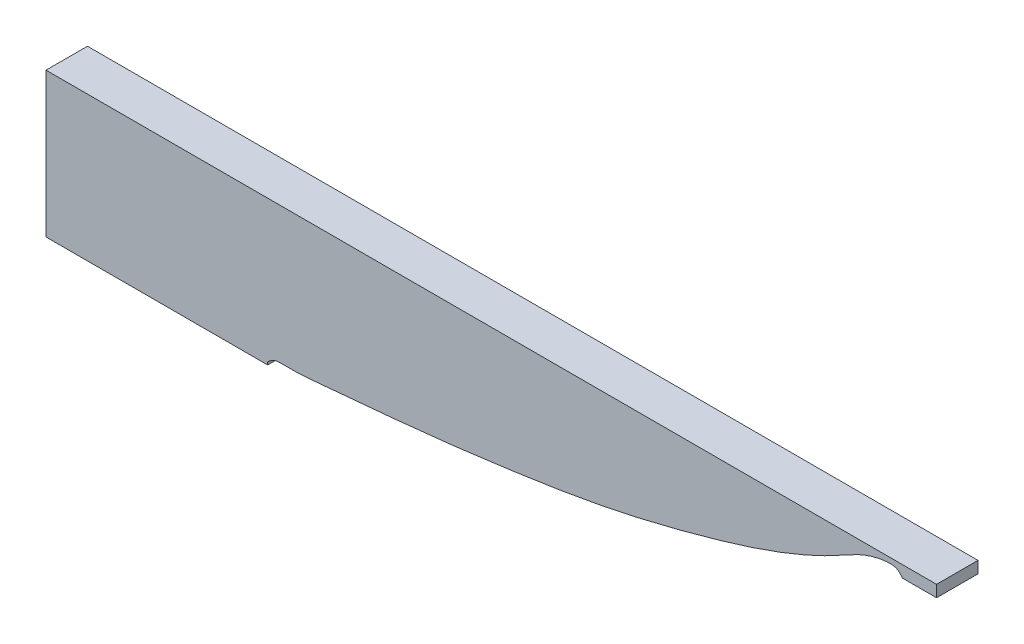
ISO-10303-21;
HEADER;
FILE_DESCRIPTION(('STEP AP214'),'2;1');
FILE_NAME('part.step','',(''),(''),'','','');
FILE_SCHEMA(('AUTOMOTIVE_DESIGN { 1 0 10303 214 1 1 1 1 }'));
ENDSEC;
DATA;
#1=APPLICATION_CONTEXT('core data for automotive mechanical design processes');
#2=APPLICATION_PROTOCOL_DEFINITION('international standard','automotive_design',2000,#1);
#3=PRODUCT_CONTEXT('',#1,'mechanical');
#4=PRODUCT('Part','Part','',(#3));
#5=PRODUCT_RELATED_PRODUCT_CATEGORY('part','',(#4));
#6=PRODUCT_DEFINITION_FORMATION('','',#4);
#7=PRODUCT_DEFINITION_CONTEXT('part definition',#1,'design');
#8=PRODUCT_DEFINITION('design','',#6,#7);
#9=PRODUCT_DEFINITION_SHAPE('','',#8);
#10=(LENGTH_UNIT() NAMED_UNIT(*) SI_UNIT(.MILLI.,.METRE.));
#11=(NAMED_UNIT(*) PLANE_ANGLE_UNIT() SI_UNIT($,.RADIAN.));
#12=(NAMED_UNIT(*) SI_UNIT($,.STERADIAN.) SOLID_ANGLE_UNIT());
#13=UNCERTAINTY_MEASURE_WITH_UNIT(LENGTH_MEASURE(1.E-05),#10,'distance_accuracy_value','');
#14=(GEOMETRIC_REPRESENTATION_CONTEXT(3) GLOBAL_UNCERTAINTY_ASSIGNED_CONTEXT((#13)) GLOBAL_UNIT_ASSIGNED_CONTEXT((#10,
#11,#12)) REPRESENTATION_CONTEXT('',''));
#15=CARTESIAN_POINT('',(0.,0.,0.));
#16=DIRECTION('',(0.,0.,1.));
#17=DIRECTION('',(1.,0.,0.));
#18=AXIS2_PLACEMENT_3D('',#15,#16,#17);
#19=CARTESIAN_POINT('',(76.554074471243,2.25600000000005,372.));
#20=DIRECTION('',(-1.,0.,0.));
#21=DIRECTION('',(0.,0.,1.));
#22=AXIS2_PLACEMENT_3D('',#19,#20,#21);
#23=PLANE('',#22);
#24=DIRECTION('',(0.,1.,0.));
#25=VECTOR('',#24,1.);
#26=CARTESIAN_POINT('',(76.554074471243,2.25600000000005,364.));
#27=LINE('',#26,#25);
#28=CARTESIAN_POINT('',(76.554074471243,0.,364.));
#29=VERTEX_POINT('',#28);
#30=CARTESIAN_POINT('',(76.554074471243,2.25600000000005,364.));
#31=VERTEX_POINT('',#30);
#32=EDGE_CURVE('E151',#29,#31,#27,.T.);
#33=ORIENTED_EDGE('',*,*,#32,.T.);
#34=DIRECTION('',(0.,0.,-1.));
#35=VECTOR('',#34,1.);
#36=CARTESIAN_POINT('',(76.554074471243,2.25600000000005,372.));
#37=LINE('',#36,#35);
#38=CARTESIAN_POINT('',(76.554074471243,2.25600000000005,372.));
#39=VERTEX_POINT('',#38);
#40=EDGE_CURVE('E11',#39,#31,#37,.T.);
#41=ORIENTED_EDGE('',*,*,#40,.F.);
#42=DIRECTION('',(0.,1.,0.));
#43=VECTOR('',#42,1.);
#44=CARTESIAN_POINT('',(76.554074471243,2.25600000000005,372.));
#45=LINE('',#44,#43);
#46=CARTESIAN_POINT('',(76.554074471243,0.,372.));
#47=VERTEX_POINT('',#46);
#48=EDGE_CURVE('E205',#47,#39,#45,.T.);
#49=ORIENTED_EDGE('',*,*,#48,.F.);
#50=DIRECTION('',(0.,0.,-1.));
#51=VECTOR('',#50,1.);
#52=CARTESIAN_POINT('',(76.554074471243,0.,372.));
#53=LINE('',#52,#51);
#54=EDGE_CURVE('E160',#47,#29,#53,.T.);
#55=ORIENTED_EDGE('',*,*,#54,.T.);
#56=EDGE_LOOP('',(#33,#41,#49,#55));
#57=FACE_BOUND('',#56,.T.);
#58=ADVANCED_FACE('F30',(#57),#23,.F.);
#59=CARTESIAN_POINT('',(76.554074471243,2.25600000000005,372.));
#60=DIRECTION('',(0.,-1.,0.));
#61=DIRECTION('',(1.,0.,0.));
#62=AXIS2_PLACEMENT_3D('',#59,#60,#61);
#63=PLANE('',#62);
#64=DIRECTION('',(-1.,0.,0.));
#65=VECTOR('',#64,1.);
#66=CARTESIAN_POINT('',(76.554074471243,2.25600000000005,364.));
#67=LINE('',#66,#65);
#68=CARTESIAN_POINT('',(-95.2696988658699,2.25600000000002,364.));
#69=VERTEX_POINT('',#68);
#70=EDGE_CURVE('E157',#31,#69,#67,.T.);
#71=ORIENTED_EDGE('',*,*,#70,.T.);
#72=DIRECTION('',(0.,0.,-1.));
#73=VECTOR('',#72,1.);
#74=CARTESIAN_POINT('',(-95.2696988658699,2.25600000000002,372.));
#75=LINE('',#74,#73);
#76=CARTESIAN_POINT('',(-95.2696988658699,2.25600000000002,372.));
#77=VERTEX_POINT('',#76);
#78=EDGE_CURVE('E39',#77,#69,#75,.T.);
#79=ORIENTED_EDGE('',*,*,#78,.F.);
#80=DIRECTION('',(-1.,0.,0.));
#81=VECTOR('',#80,1.);
#82=CARTESIAN_POINT('',(76.554074471243,2.25600000000005,372.));
#83=LINE('',#82,#81);
#84=EDGE_CURVE('E86',#39,#77,#83,.T.);
#85=ORIENTED_EDGE('',*,*,#84,.F.);
#86=ORIENTED_EDGE('',*,*,#40,.T.);
#87=EDGE_LOOP('',(#71,#79,#85,#86));
#88=FACE_BOUND('',#87,.T.);
#89=ADVANCED_FACE('F211',(#88),#63,.F.);
#90=CARTESIAN_POINT('',(-95.2696988658699,-25.6242706597705,372.));
#91=DIRECTION('',(1.,0.,0.));
#92=DIRECTION('',(0.,0.,-1.));
#93=AXIS2_PLACEMENT_3D('',#90,#91,#92);
#94=PLANE('',#93);
#95=DIRECTION('',(0.,-1.,0.));
#96=VECTOR('',#95,1.);
#97=CARTESIAN_POINT('',(-95.2696988658699,-25.6242706597705,364.));
#98=LINE('',#97,#96);
#99=CARTESIAN_POINT('',(-95.2696988658699,-25.6242706597705,364.));
#100=VERTEX_POINT('',#99);
#101=EDGE_CURVE('E159',#69,#100,#98,.T.);
#102=ORIENTED_EDGE('',*,*,#101,.T.);
#103=DIRECTION('',(0.,0.,-1.));
#104=VECTOR('',#103,1.);
#105=CARTESIAN_POINT('',(-95.2696988658699,-25.6242706597705,372.));
#106=LINE('',#105,#104);
#107=CARTESIAN_POINT('',(-95.2696988658699,-25.6242706597705,372.));
#108=VERTEX_POINT('',#107);
#109=EDGE_CURVE('E113',#108,#100,#106,.T.);
#110=ORIENTED_EDGE('',*,*,#109,.F.);
#111=DIRECTION('',(0.,-1.,0.));
#112=VECTOR('',#111,1.);
#113=CARTESIAN_POINT('',(-95.2696988658699,-25.6242706597705,372.));
#114=LINE('',#113,#112);
#115=EDGE_CURVE('E101',#77,#108,#114,.T.);
#116=ORIENTED_EDGE('',*,*,#115,.F.);
#117=ORIENTED_EDGE('',*,*,#78,.T.);
#118=EDGE_LOOP('',(#102,#110,#116,#117));
#119=FACE_BOUND('',#118,.T.);
#120=ADVANCED_FACE('F208',(#119),#94,.F.);
#121=CARTESIAN_POINT('',(-95.2696988658699,-25.6242706597705,372.));
#122=CARTESIAN_POINT('',(-81.0139028033081,-25.624809510448,372.));
#123=CARTESIAN_POINT('',(-66.7581067488435,-25.6255756586344,372.));
#124=CARTESIAN_POINT('',(-52.5023107043328,-25.6264728907151,372.));
#125=B_SPLINE_CURVE_WITH_KNOTS('',3,(#121,#122,#123,#124),.UNSPECIFIED.,.F.,.F.,(4,4),(0.,1.),.UNSPECIFIED.);
#126=DIRECTION('',(0.,0.,-1.));
#127=VECTOR('',#126,1.);
#128=SURFACE_OF_LINEAR_EXTRUSION('',#125,#127);
#129=CARTESIAN_POINT('',(-95.2696988658699,-25.6242706597705,364.));
#130=CARTESIAN_POINT('',(-81.0139028033081,-25.624809510448,364.));
#131=CARTESIAN_POINT('',(-66.7581067488435,-25.6255756586344,364.));
#132=CARTESIAN_POINT('',(-52.5023107043328,-25.6264728907151,364.));
#133=B_SPLINE_CURVE_WITH_KNOTS('',3,(#129,#130,#131,#132),.UNSPECIFIED.,.F.,.F.,(4,4),(0.,1.),.UNSPECIFIED.);
#134=CARTESIAN_POINT('',(-52.5023107043328,-25.6264728907151,364.));
#135=VERTEX_POINT('',#134);
#136=EDGE_CURVE('E111',#100,#135,#133,.T.);
#137=ORIENTED_EDGE('',*,*,#136,.T.);
#138=DIRECTION('',(0.,0.,-1.));
#139=VECTOR('',#138,1.);
#140=CARTESIAN_POINT('',(-52.5023107043328,-25.6264728907151,372.));
#141=LINE('',#140,#139);
#142=CARTESIAN_POINT('',(-52.5023107043328,-25.6264728907151,372.));
#143=VERTEX_POINT('',#142);
#144=EDGE_CURVE('E108',#143,#135,#141,.T.);
#145=ORIENTED_EDGE('',*,*,#144,.F.);
#146=CARTESIAN_POINT('',(-52.5023107043328,-25.6264728907151,372.));
#147=CARTESIAN_POINT('',(-66.7581067488435,-25.6255756586344,372.));
#148=CARTESIAN_POINT('',(-81.0139028033081,-25.624809510448,372.));
#149=CARTESIAN_POINT('',(-95.2696988658699,-25.6242706597705,372.));
#150=B_SPLINE_CURVE_WITH_KNOTS('',3,(#146,#147,#148,#149),.UNSPECIFIED.,.F.,.F.,(4,4),(0.,1.),.UNSPECIFIED.);
#151=EDGE_CURVE('E93',#108,#143,#150,.F.);
#152=ORIENTED_EDGE('',*,*,#151,.F.);
#153=ORIENTED_EDGE('',*,*,#109,.T.);
#154=EDGE_LOOP('',(#137,#145,#152,#153));
#155=FACE_BOUND('',#154,.T.);
#156=ADVANCED_FACE('F109',(#155),#128,.F.);
#157=CARTESIAN_POINT('',(-52.5023107043328,-25.6264728907151,372.));
#158=CARTESIAN_POINT('',(-52.5229256508565,-25.5463213521394,372.));
#159=CARTESIAN_POINT('',(-52.5432094913487,-25.4651269699417,372.));
#160=CARTESIAN_POINT('',(-52.5475703975625,-25.2971179084436,372.));
#161=CARTESIAN_POINT('',(-52.5316413195811,-25.2126196533509,372.));
#162=CARTESIAN_POINT('',(-52.4623461969312,-25.0610119505564,372.));
#163=CARTESIAN_POINT('',(-52.4058691122357,-24.9963344185934,372.));
#164=CARTESIAN_POINT('',(-52.2803467765031,-24.8853328352141,372.));
#165=CARTESIAN_POINT('',(-52.2140749537516,-24.8334263440751,372.));
#166=CARTESIAN_POINT('',(-52.0176290204207,-24.675791377307,372.));
#167=CARTESIAN_POINT('',(-51.8823331995736,-24.5764939571899,372.));
#168=CARTESIAN_POINT('',(-51.599704532937,-24.3985366887683,372.));
#169=CARTESIAN_POINT('',(-51.4484496776901,-24.3218635566523,372.));
#170=CARTESIAN_POINT('',(-50.9783063662971,-24.1478792353953,372.));
#171=CARTESIAN_POINT('',(-50.6539358613737,-24.0973057740721,372.));
#172=CARTESIAN_POINT('',(-49.9974725152397,-24.0423279309472,372.));
#173=CARTESIAN_POINT('',(-49.665072095016,-24.0376565350464,372.));
#174=CARTESIAN_POINT('',(-49.0022510316564,-24.0449391060509,372.));
#175=CARTESIAN_POINT('',(-48.6708376664953,-24.0570855869448,372.));
#176=CARTESIAN_POINT('',(-48.0080154663065,-24.0677805519017,372.));
#177=CARTESIAN_POINT('',(-47.6766064282237,-24.0669385421173,372.));
#178=CARTESIAN_POINT('',(-46.6823844800794,-24.0489055365054,372.));
#179=CARTESIAN_POINT('',(-46.0197830590571,-24.0153377699827,372.));
#180=CARTESIAN_POINT('',(-44.6977554341914,-23.9222468538306,372.));
#181=CARTESIAN_POINT('',(-44.0375376575946,-23.8659625047739,372.));
#182=CARTESIAN_POINT('',(-42.7171772890951,-23.7524739793025,372.));
#183=CARTESIAN_POINT('',(-42.0569703934686,-23.6960565098786,372.));
#184=CARTESIAN_POINT('',(-40.0766557193515,-23.5230602689808,372.));
#185=CARTESIAN_POINT('',(-38.7568416561619,-23.4028511925593,372.));
#186=CARTESIAN_POINT('',(-32.1580944647688,-22.7982561811925,372.));
#187=CARTESIAN_POINT('',(-26.879453767499,-22.3087631921668,372.));
#188=CARTESIAN_POINT('',(-18.9734649712514,-21.4582350208804,372.));
#189=CARTESIAN_POINT('',(-16.3404586018558,-21.1542798196116,372.));
#190=CARTESIAN_POINT('',(-11.0806255882027,-20.5001927129979,372.));
#191=CARTESIAN_POINT('',(-8.45342525675494,-20.1519786986924,372.));
#192=CARTESIAN_POINT('',(-3.20349340487505,-19.420719786164,372.));
#193=CARTESIAN_POINT('',(-0.580491660358561,-19.0383480813937,372.));
#194=CARTESIAN_POINT('',(4.65568649860355,-18.2195147683401,372.));
#195=CARTESIAN_POINT('',(7.26891475586805,-17.7818448236934,372.));
#196=CARTESIAN_POINT('',(12.4796275487936,-16.8149953331991,372.));
#197=CARTESIAN_POINT('',(15.0776685756316,-16.2842202121121,372.));
#198=CARTESIAN_POINT('',(20.2524030035779,-15.1310433196781,372.));
#199=CARTESIAN_POINT('',(22.8303379920093,-14.5106754349363,372.));
#200=CARTESIAN_POINT('',(27.9684216788741,-13.205505340923,372.));
#201=CARTESIAN_POINT('',(30.5280841920609,-12.5195517175186,372.));
#202=CARTESIAN_POINT('',(35.6254192914611,-11.0694115330718,372.));
#203=CARTESIAN_POINT('',(38.1641498421797,-10.3074998774814,372.));
#204=CARTESIAN_POINT('',(41.9444998308483,-9.07054506257215,372.));
#205=CARTESIAN_POINT('',(43.1988312199809,-8.64223441367693,372.));
#206=CARTESIAN_POINT('',(45.6928161483929,-7.74503876762491,372.));
#207=CARTESIAN_POINT('',(46.9322384779667,-7.27551463168344,372.));
#208=CARTESIAN_POINT('',(49.395882030046,-6.29444555850322,372.));
#209=CARTESIAN_POINT('',(50.619539614839,-5.78401896063258,372.));
#210=CARTESIAN_POINT('',(53.041501448615,-4.71029932041644,372.));
#211=CARTESIAN_POINT('',(54.2399974851551,-4.14643364618422,372.));
#212=CARTESIAN_POINT('',(56.0099721729587,-3.24056764090749,372.));
#213=CARTESIAN_POINT('',(56.5953947726055,-2.92874670652704,372.));
#214=CARTESIAN_POINT('',(57.7613904038113,-2.29451980307995,372.));
#215=CARTESIAN_POINT('',(58.3412853429372,-1.97063079956547,372.));
#216=CARTESIAN_POINT('',(60.0846707573307,-1.00704454470877,372.));
#217=CARTESIAN_POINT('',(61.252916238154,-0.377730493165289,372.));
#218=CARTESIAN_POINT('',(63.0975605182903,0.364743289364263,372.));
#219=CARTESIAN_POINT('',(63.7286900295671,0.576754652992008,372.));
#220=CARTESIAN_POINT('',(64.7005535101307,0.839811305430399,372.));
#221=CARTESIAN_POINT('',(65.0294944120179,0.91879488142699,372.));
#222=CARTESIAN_POINT('',(65.6886233751766,1.05540806767738,372.));
#223=CARTESIAN_POINT('',(66.019480554072,1.11290118012746,372.));
#224=CARTESIAN_POINT('',(66.6841022441833,1.20356741807372,372.));
#225=CARTESIAN_POINT('',(67.0178003846865,1.23729573805273,372.));
#226=CARTESIAN_POINT('',(67.5228139801048,1.2505266766582,372.));
#227=CARTESIAN_POINT('',(67.6918790092392,1.24885422466744,372.));
#228=CARTESIAN_POINT('',(68.0317634669838,1.23083367729227,372.));
#229=CARTESIAN_POINT('',(68.2004144682083,1.21397244815044,372.));
#230=CARTESIAN_POINT('',(68.5326221602768,1.15216181542863,372.));
#231=CARTESIAN_POINT('',(68.6988125400901,1.10569486331918,372.));
#232=CARTESIAN_POINT('',(69.0077479979926,0.965644271374175,372.));
#233=CARTESIAN_POINT('',(69.1469849114944,0.869411746915614,372.));
#234=CARTESIAN_POINT('',(69.4074335637855,0.648298130130504,372.));
#235=CARTESIAN_POINT('',(69.5254409157133,0.525375865869533,372.));
#236=CARTESIAN_POINT('',(69.7078627674449,0.346469054941106,372.));
#237=CARTESIAN_POINT('',(69.7689119920965,0.287078332518719,372.));
#238=CARTESIAN_POINT('',(69.8791956902263,0.156338543355102,372.));
#239=CARTESIAN_POINT('',(69.9254798363757,0.0832413985340615,372.));
#240=CARTESIAN_POINT('',(69.9471230349488,1.45215328477277E-13,372.));
#241=B_SPLINE_CURVE_WITH_KNOTS('',3,(#157,#158,#159,#160,#161,#162,#163,#164,#165,#166,#167,
#168,#169,#170,#171,#172,#173,#174,#175,#176,#177,#178,#179,#180,#181,#182,#183,#184,#185,#186,
#187,#188,#189,#190,#191,#192,#193,#194,#195,#196,#197,#198,#199,#200,#201,#202,#203,#204,#205,
#206,#207,#208,#209,#210,#211,#212,#213,#214,#215,#216,#217,#218,#219,#220,#221,#222,#223,#224,
#225,#226,#227,#228,#229,#230,#231,#232,#233,#234,#235,#236,#237,#238,#239,#240),.UNSPECIFIED.,
.F.,.F.,(4,2,2,2,2,2,2,2,2,2,2,2,2,2,2,2,2,2,2,2,2,2,2,2,2,2,2,2,2,2,2,2,2,2,2,2,2,2,2,2,2,4),
(0.,0.001953125,0.00390624999999989,0.00585937499999989,0.00781249999999989,0.0117187499999998,
0.0156249999999997,0.0234374999999997,0.0312499999999996,0.0390624999999996,0.0468749999999996,
0.0624999999999996,0.0781249999999996,0.0937499999999996,0.125,0.25,0.3125,0.375,
0.437499999999999,0.499999999999999,0.562499999999999,0.624999999999999,0.687499999999999,
0.749999999999999,0.781249999999999,0.8125,0.84375,0.875,0.890625,0.90625,0.9375,0.953125,
0.9609375,0.96875,0.976562500000001,0.980468750000001,0.984375000000001,0.98828125,0.9921875,
0.99609375,0.998046875,1.),.UNSPECIFIED.);
#242=DIRECTION('',(0.,0.,-1.));
#243=VECTOR('',#242,1.);
#244=SURFACE_OF_LINEAR_EXTRUSION('',#241,#243);
#245=CARTESIAN_POINT('',(-52.5023107043328,-25.6264728907151,364.));
#246=CARTESIAN_POINT('',(-52.5229256508565,-25.5463213521394,364.));
#247=CARTESIAN_POINT('',(-52.5432094913487,-25.4651269699417,364.));
#248=CARTESIAN_POINT('',(-52.5475703975625,-25.2971179084436,364.));
#249=CARTESIAN_POINT('',(-52.5316413195811,-25.2126196533509,364.));
#250=CARTESIAN_POINT('',(-52.4623461969312,-25.0610119505564,364.));
#251=CARTESIAN_POINT('',(-52.4058691122357,-24.9963344185934,364.));
#252=CARTESIAN_POINT('',(-52.2803467765031,-24.8853328352141,364.));
#253=CARTESIAN_POINT('',(-52.2140749537516,-24.8334263440751,364.));
#254=CARTESIAN_POINT('',(-52.0176290204207,-24.675791377307,364.));
#255=CARTESIAN_POINT('',(-51.8823331995736,-24.5764939571899,364.));
#256=CARTESIAN_POINT('',(-51.599704532937,-24.3985366887683,364.));
#257=CARTESIAN_POINT('',(-51.4484496776901,-24.3218635566523,364.));
#258=CARTESIAN_POINT('',(-50.9783063662971,-24.1478792353953,364.));
#259=CARTESIAN_POINT('',(-50.6539358613737,-24.0973057740721,364.));
#260=CARTESIAN_POINT('',(-49.9974725152397,-24.0423279309472,364.));
#261=CARTESIAN_POINT('',(-49.665072095016,-24.0376565350464,364.));
#262=CARTESIAN_POINT('',(-49.0022510316564,-24.0449391060509,364.));
#263=CARTESIAN_POINT('',(-48.6708376664953,-24.0570855869448,364.));
#264=CARTESIAN_POINT('',(-48.0080154663065,-24.0677805519017,364.));
#265=CARTESIAN_POINT('',(-47.6766064282237,-24.0669385421173,364.));
#266=CARTESIAN_POINT('',(-46.6823844800794,-24.0489055365054,364.));
#267=CARTESIAN_POINT('',(-46.0197830590571,-24.0153377699827,364.));
#268=CARTESIAN_POINT('',(-44.6977554341914,-23.9222468538306,364.));
#269=CARTESIAN_POINT('',(-44.0375376575946,-23.8659625047739,364.));
#270=CARTESIAN_POINT('',(-42.7171772890951,-23.7524739793025,364.));
#271=CARTESIAN_POINT('',(-42.0569703934686,-23.6960565098786,364.));
#272=CARTESIAN_POINT('',(-40.0766557193515,-23.5230602689808,364.));
#273=CARTESIAN_POINT('',(-38.7568416561619,-23.4028511925593,364.));
#274=CARTESIAN_POINT('',(-32.1580944647688,-22.7982561811925,364.));
#275=CARTESIAN_POINT('',(-26.879453767499,-22.3087631921668,364.));
#276=CARTESIAN_POINT('',(-18.9734649712514,-21.4582350208804,364.));
#277=CARTESIAN_POINT('',(-16.3404586018558,-21.1542798196116,364.));
#278=CARTESIAN_POINT('',(-11.0806255882027,-20.5001927129979,364.));
#279=CARTESIAN_POINT('',(-8.45342525675494,-20.1519786986924,364.));
#280=CARTESIAN_POINT('',(-3.20349340487505,-19.420719786164,364.));
#281=CARTESIAN_POINT('',(-0.580491660358561,-19.0383480813937,364.));
#282=CARTESIAN_POINT('',(4.65568649860355,-18.2195147683401,364.));
#283=CARTESIAN_POINT('',(7.26891475586805,-17.7818448236934,364.));
#284=CARTESIAN_POINT('',(12.4796275487936,-16.8149953331991,364.));
#285=CARTESIAN_POINT('',(15.0776685756316,-16.2842202121121,364.));
#286=CARTESIAN_POINT('',(20.2524030035779,-15.1310433196781,364.));
#287=CARTESIAN_POINT('',(22.8303379920093,-14.5106754349363,364.));
#288=CARTESIAN_POINT('',(27.9684216788741,-13.205505340923,364.));
#289=CARTESIAN_POINT('',(30.5280841920609,-12.5195517175186,364.));
#290=CARTESIAN_POINT('',(35.6254192914611,-11.0694115330718,364.));
#291=CARTESIAN_POINT('',(38.1641498421797,-10.3074998774814,364.));
#292=CARTESIAN_POINT('',(41.9444998308483,-9.07054506257215,364.));
#293=CARTESIAN_POINT('',(43.1988312199809,-8.64223441367693,364.));
#294=CARTESIAN_POINT('',(45.6928161483929,-7.74503876762491,364.));
#295=CARTESIAN_POINT('',(46.9322384779667,-7.27551463168344,364.));
#296=CARTESIAN_POINT('',(49.395882030046,-6.29444555850322,364.));
#297=CARTESIAN_POINT('',(50.619539614839,-5.78401896063258,364.));
#298=CARTESIAN_POINT('',(53.041501448615,-4.71029932041644,364.));
#299=CARTESIAN_POINT('',(54.2399974851551,-4.14643364618422,364.));
#300=CARTESIAN_POINT('',(56.0099721729587,-3.24056764090749,364.));
#301=CARTESIAN_POINT('',(56.5953947726055,-2.92874670652704,364.));
#302=CARTESIAN_POINT('',(57.7613904038113,-2.29451980307995,364.));
#303=CARTESIAN_POINT('',(58.3412853429372,-1.97063079956547,364.));
#304=CARTESIAN_POINT('',(60.0846707573307,-1.00704454470877,364.));
#305=CARTESIAN_POINT('',(61.252916238154,-0.377730493165289,364.));
#306=CARTESIAN_POINT('',(63.0975605182903,0.364743289364263,364.));
#307=CARTESIAN_POINT('',(63.7286900295671,0.576754652992008,364.));
#308=CARTESIAN_POINT('',(64.7005535101307,0.839811305430399,364.));
#309=CARTESIAN_POINT('',(65.0294944120179,0.91879488142699,364.));
#310=CARTESIAN_POINT('',(65.6886233751766,1.05540806767738,364.));
#311=CARTESIAN_POINT('',(66.019480554072,1.11290118012746,364.));
#312=CARTESIAN_POINT('',(66.6841022441833,1.20356741807372,364.));
#313=CARTESIAN_POINT('',(67.0178003846865,1.23729573805273,364.));
#314=CARTESIAN_POINT('',(67.5228139801048,1.2505266766582,364.));
#315=CARTESIAN_POINT('',(67.6918790092392,1.24885422466744,364.));
#316=CARTESIAN_POINT('',(68.0317634669838,1.23083367729227,364.));
#317=CARTESIAN_POINT('',(68.2004144682083,1.21397244815044,364.));
#318=CARTESIAN_POINT('',(68.5326221602768,1.15216181542863,364.));
#319=CARTESIAN_POINT('',(68.6988125400901,1.10569486331918,364.));
#320=CARTESIAN_POINT('',(69.0077479979926,0.965644271374175,364.));
#321=CARTESIAN_POINT('',(69.1469849114944,0.869411746915614,364.));
#322=CARTESIAN_POINT('',(69.4074335637855,0.648298130130504,364.));
#323=CARTESIAN_POINT('',(69.5254409157133,0.525375865869533,364.));
#324=CARTESIAN_POINT('',(69.7078627674449,0.346469054941106,364.));
#325=CARTESIAN_POINT('',(69.7689119920965,0.287078332518719,364.));
#326=CARTESIAN_POINT('',(69.8791956902263,0.156338543355102,364.));
#327=CARTESIAN_POINT('',(69.9254798363757,0.0832413985340615,364.));
#328=CARTESIAN_POINT('',(69.9471230349488,1.45215328477277E-13,364.));
#329=B_SPLINE_CURVE_WITH_KNOTS('',3,(#245,#246,#247,#248,#249,#250,#251,#252,#253,#254,#255,
#256,#257,#258,#259,#260,#261,#262,#263,#264,#265,#266,#267,#268,#269,#270,#271,#272,#273,#274,
#275,#276,#277,#278,#279,#280,#281,#282,#283,#284,#285,#286,#287,#288,#289,#290,#291,#292,#293,
#294,#295,#296,#297,#298,#299,#300,#301,#302,#303,#304,#305,#306,#307,#308,#309,#310,#311,#312,
#313,#314,#315,#316,#317,#318,#319,#320,#321,#322,#323,#324,#325,#326,#327,#328),.UNSPECIFIED.,
.F.,.F.,(4,2,2,2,2,2,2,2,2,2,2,2,2,2,2,2,2,2,2,2,2,2,2,2,2,2,2,2,2,2,2,2,2,2,2,2,2,2,2,2,2,4),
(0.,0.001953125,0.00390624999999989,0.00585937499999989,0.00781249999999989,0.0117187499999998,
0.0156249999999997,0.0234374999999997,0.0312499999999996,0.0390624999999996,0.0468749999999996,
0.0624999999999996,0.0781249999999996,0.0937499999999996,0.125,0.25,0.3125,0.375,
0.437499999999999,0.499999999999999,0.562499999999999,0.624999999999999,0.687499999999999,
0.749999999999999,0.781249999999999,0.8125,0.84375,0.875,0.890625,0.90625,0.9375,0.953125,
0.9609375,0.96875,0.976562500000001,0.980468750000001,0.984375000000001,0.98828125,0.9921875,
0.99609375,0.998046875,1.),.UNSPECIFIED.);
#330=CARTESIAN_POINT('',(69.9471230349488,1.45215328477277E-13,364.));
#331=VERTEX_POINT('',#330);
#332=EDGE_CURVE('E71',#135,#331,#329,.T.);
#333=ORIENTED_EDGE('',*,*,#332,.T.);
#334=DIRECTION('',(0.,0.,-1.));
#335=VECTOR('',#334,1.);
#336=CARTESIAN_POINT('',(69.9471230349488,1.45215328477277E-13,372.));
#337=LINE('',#336,#335);
#338=CARTESIAN_POINT('',(69.9471230349488,1.45215328477277E-13,372.));
#339=VERTEX_POINT('',#338);
#340=EDGE_CURVE('E114',#339,#331,#337,.T.);
#341=ORIENTED_EDGE('',*,*,#340,.F.);
#342=CARTESIAN_POINT('',(69.9471230349488,1.45215328477277E-13,372.));
#343=CARTESIAN_POINT('',(69.9254798363757,0.0832413985340615,372.));
#344=CARTESIAN_POINT('',(69.8791956902263,0.156338543355102,372.));
#345=CARTESIAN_POINT('',(69.7689119920965,0.287078332518719,372.));
#346=CARTESIAN_POINT('',(69.7078627674449,0.346469054941106,372.));
#347=CARTESIAN_POINT('',(69.5254409157133,0.525375865869533,372.));
#348=CARTESIAN_POINT('',(69.4074335637855,0.648298130130504,372.));
#349=CARTESIAN_POINT('',(69.1469849114944,0.869411746915614,372.));
#350=CARTESIAN_POINT('',(69.0077479979926,0.965644271374175,372.));
#351=CARTESIAN_POINT('',(68.6988125400901,1.10569486331918,372.));
#352=CARTESIAN_POINT('',(68.5326221602768,1.15216181542863,372.));
#353=CARTESIAN_POINT('',(68.2004144682083,1.21397244815044,372.));
#354=CARTESIAN_POINT('',(68.0317634669838,1.23083367729227,372.));
#355=CARTESIAN_POINT('',(67.6918790092392,1.24885422466744,372.));
#356=CARTESIAN_POINT('',(67.5228139801048,1.2505266766582,372.));
#357=CARTESIAN_POINT('',(67.0178003846865,1.23729573805273,372.));
#358=CARTESIAN_POINT('',(66.6841022441833,1.20356741807372,372.));
#359=CARTESIAN_POINT('',(66.019480554072,1.11290118012746,372.));
#360=CARTESIAN_POINT('',(65.6886233751766,1.05540806767738,372.));
#361=CARTESIAN_POINT('',(65.0294944120179,0.91879488142699,372.));
#362=CARTESIAN_POINT('',(64.7005535101307,0.839811305430399,372.));
#363=CARTESIAN_POINT('',(63.7286900295671,0.576754652992008,372.));
#364=CARTESIAN_POINT('',(63.0975605182903,0.364743289364263,372.));
#365=CARTESIAN_POINT('',(61.252916238154,-0.377730493165289,372.));
#366=CARTESIAN_POINT('',(60.0846707573307,-1.00704454470877,372.));
#367=CARTESIAN_POINT('',(58.3412853429372,-1.97063079956547,372.));
#368=CARTESIAN_POINT('',(57.7613904038113,-2.29451980307995,372.));
#369=CARTESIAN_POINT('',(56.5953947726055,-2.92874670652704,372.));
#370=CARTESIAN_POINT('',(56.0099721729587,-3.24056764090749,372.));
#371=CARTESIAN_POINT('',(54.2399974851551,-4.14643364618422,372.));
#372=CARTESIAN_POINT('',(53.041501448615,-4.71029932041644,372.));
#373=CARTESIAN_POINT('',(50.619539614839,-5.78401896063258,372.));
#374=CARTESIAN_POINT('',(49.395882030046,-6.29444555850322,372.));
#375=CARTESIAN_POINT('',(46.9322384779667,-7.27551463168344,372.));
#376=CARTESIAN_POINT('',(45.6928161483929,-7.74503876762491,372.));
#377=CARTESIAN_POINT('',(43.1988312199809,-8.64223441367693,372.));
#378=CARTESIAN_POINT('',(41.9444998308483,-9.07054506257215,372.));
#379=CARTESIAN_POINT('',(38.1641498421797,-10.3074998774814,372.));
#380=CARTESIAN_POINT('',(35.6254192914611,-11.0694115330718,372.));
#381=CARTESIAN_POINT('',(30.5280841920609,-12.5195517175186,372.));
#382=CARTESIAN_POINT('',(27.9684216788741,-13.205505340923,372.));
#383=CARTESIAN_POINT('',(22.8303379920093,-14.5106754349363,372.));
#384=CARTESIAN_POINT('',(20.2524030035779,-15.1310433196781,372.));
#385=CARTESIAN_POINT('',(15.0776685756316,-16.2842202121121,372.));
#386=CARTESIAN_POINT('',(12.4796275487936,-16.8149953331991,372.));
#387=CARTESIAN_POINT('',(7.26891475586805,-17.7818448236934,372.));
#388=CARTESIAN_POINT('',(4.65568649860355,-18.2195147683401,372.));
#389=CARTESIAN_POINT('',(-0.580491660358561,-19.0383480813937,372.));
#390=CARTESIAN_POINT('',(-3.20349340487505,-19.420719786164,372.));
#391=CARTESIAN_POINT('',(-8.45342525675494,-20.1519786986924,372.));
#392=CARTESIAN_POINT('',(-11.0806255882027,-20.5001927129979,372.));
#393=CARTESIAN_POINT('',(-16.3404586018558,-21.1542798196116,372.));
#394=CARTESIAN_POINT('',(-18.9734649712514,-21.4582350208804,372.));
#395=CARTESIAN_POINT('',(-26.879453767499,-22.3087631921668,372.));
#396=CARTESIAN_POINT('',(-32.1580944647688,-22.7982561811925,372.));
#397=CARTESIAN_POINT('',(-38.7568416561619,-23.4028511925593,372.));
#398=CARTESIAN_POINT('',(-40.0766557193515,-23.5230602689808,372.));
#399=CARTESIAN_POINT('',(-42.0569703934686,-23.6960565098786,372.));
#400=CARTESIAN_POINT('',(-42.7171772890951,-23.7524739793025,372.));
#401=CARTESIAN_POINT('',(-44.0375376575946,-23.8659625047739,372.));
#402=CARTESIAN_POINT('',(-44.6977554341914,-23.9222468538306,372.));
#403=CARTESIAN_POINT('',(-46.0197830590571,-24.0153377699827,372.));
#404=CARTESIAN_POINT('',(-46.6823844800794,-24.0489055365054,372.));
#405=CARTESIAN_POINT('',(-47.6766064282237,-24.0669385421173,372.));
#406=CARTESIAN_POINT('',(-48.0080154663065,-24.0677805519017,372.));
#407=CARTESIAN_POINT('',(-48.6708376664953,-24.0570855869448,372.));
#408=CARTESIAN_POINT('',(-49.0022510316564,-24.0449391060509,372.));
#409=CARTESIAN_POINT('',(-49.665072095016,-24.0376565350464,372.));
#410=CARTESIAN_POINT('',(-49.9974725152397,-24.0423279309472,372.));
#411=CARTESIAN_POINT('',(-50.6539358613737,-24.0973057740721,372.));
#412=CARTESIAN_POINT('',(-50.9783063662971,-24.1478792353953,372.));
#413=CARTESIAN_POINT('',(-51.4484496776901,-24.3218635566523,372.));
#414=CARTESIAN_POINT('',(-51.599704532937,-24.3985366887683,372.));
#415=CARTESIAN_POINT('',(-51.8823331995736,-24.5764939571899,372.));
#416=CARTESIAN_POINT('',(-52.0176290204207,-24.675791377307,372.));
#417=CARTESIAN_POINT('',(-52.2140749537516,-24.8334263440751,372.));
#418=CARTESIAN_POINT('',(-52.2803467765031,-24.8853328352141,372.));
#419=CARTESIAN_POINT('',(-52.4058691122357,-24.9963344185934,372.));
#420=CARTESIAN_POINT('',(-52.4623461969312,-25.0610119505564,372.));
#421=CARTESIAN_POINT('',(-52.5316413195811,-25.2126196533509,372.));
#422=CARTESIAN_POINT('',(-52.5475703975625,-25.2971179084436,372.));
#423=CARTESIAN_POINT('',(-52.5432094913487,-25.4651269699417,372.));
#424=CARTESIAN_POINT('',(-52.5229256508565,-25.5463213521394,372.));
#425=CARTESIAN_POINT('',(-52.5023107043328,-25.6264728907151,372.));
#426=B_SPLINE_CURVE_WITH_KNOTS('',3,(#342,#343,#344,#345,#346,#347,#348,#349,#350,#351,#352,
#353,#354,#355,#356,#357,#358,#359,#360,#361,#362,#363,#364,#365,#366,#367,#368,#369,#370,#371,
#372,#373,#374,#375,#376,#377,#378,#379,#380,#381,#382,#383,#384,#385,#386,#387,#388,#389,#390,
#391,#392,#393,#394,#395,#396,#397,#398,#399,#400,#401,#402,#403,#404,#405,#406,#407,#408,#409,
#410,#411,#412,#413,#414,#415,#416,#417,#418,#419,#420,#421,#422,#423,#424,#425),.UNSPECIFIED.,
.F.,.F.,(4,2,2,2,2,2,2,2,2,2,2,2,2,2,2,2,2,2,2,2,2,2,2,2,2,2,2,2,2,2,2,2,2,2,2,2,2,2,2,2,2,4),
(0.,0.00195312499999989,0.00390624999999967,0.00781249999999967,0.0117187499999996,
0.0156249999999994,0.0195312499999994,0.0234374999999993,0.0312499999999996,0.0390624999999997,
0.0468749999999999,0.0625,0.09375,0.109375,0.125,0.15625,0.1875,0.218750000000001,
0.250000000000001,0.312500000000001,0.375000000000001,0.437500000000001,0.500000000000001,
0.562500000000001,0.625,0.6875,0.75,0.875,0.90625,0.921875,0.9375,0.953125,0.9609375,0.96875,
0.9765625,0.984375,0.98828125,0.9921875,0.994140625,0.99609375,0.998046875,1.),.UNSPECIFIED.);
#427=EDGE_CURVE('E98',#143,#339,#426,.F.);
#428=ORIENTED_EDGE('',*,*,#427,.F.);
#429=ORIENTED_EDGE('',*,*,#144,.T.);
#430=EDGE_LOOP('',(#333,#341,#428,#429));
#431=FACE_BOUND('',#430,.T.);
#432=ADVANCED_FACE('F117',(#431),#244,.F.);
#433=CARTESIAN_POINT('',(69.9471230349519,0.,372.));
#434=DIRECTION('',(0.,1.,0.));
#435=DIRECTION('',(-1.,0.,0.));
#436=AXIS2_PLACEMENT_3D('',#433,#434,#435);
#437=PLANE('',#436);
#438=DIRECTION('',(1.,0.,0.));
#439=VECTOR('',#438,1.);
#440=CARTESIAN_POINT('',(69.9471230349519,0.,364.));
#441=LINE('',#440,#439);
#442=EDGE_CURVE('E78',#331,#29,#441,.T.);
#443=ORIENTED_EDGE('',*,*,#442,.T.);
#444=ORIENTED_EDGE('',*,*,#54,.F.);
#445=DIRECTION('',(1.,0.,0.));
#446=VECTOR('',#445,1.);
#447=CARTESIAN_POINT('',(69.9471230349519,0.,372.));
#448=LINE('',#447,#446);
#449=EDGE_CURVE('E48',#339,#47,#448,.T.);
#450=ORIENTED_EDGE('',*,*,#449,.F.);
#451=ORIENTED_EDGE('',*,*,#340,.T.);
#452=EDGE_LOOP('',(#443,#444,#450,#451));
#453=FACE_BOUND('',#452,.T.);
#454=ADVANCED_FACE('F137',(#453),#437,.F.);
#455=CARTESIAN_POINT('',(9.87427115233092,-17.2984200784463,372.));
#456=DIRECTION('',(0.,0.,-1.));
#457=DIRECTION('',(-1.,0.,0.));
#458=AXIS2_PLACEMENT_3D('',#455,#456,#457);
#459=PLANE('',#458);
#460=ORIENTED_EDGE('',*,*,#48,.T.);
#461=ORIENTED_EDGE('',*,*,#84,.T.);
#462=ORIENTED_EDGE('',*,*,#115,.T.);
#463=ORIENTED_EDGE('',*,*,#151,.T.);
#464=ORIENTED_EDGE('',*,*,#427,.T.);
#465=ORIENTED_EDGE('',*,*,#449,.T.);
#466=EDGE_LOOP('',(#460,#461,#462,#463,#464,#465));
#467=FACE_BOUND('',#466,.T.);
#468=ADVANCED_FACE('F96',(#467),#459,.F.);
#469=CARTESIAN_POINT('',(9.87427115233092,-17.2984200784463,364.));
#470=DIRECTION('',(0.,0.,-1.));
#471=DIRECTION('',(-1.,0.,0.));
#472=AXIS2_PLACEMENT_3D('',#469,#470,#471);
#473=PLANE('',#472);
#474=ORIENTED_EDGE('',*,*,#32,.F.);
#475=ORIENTED_EDGE('',*,*,#442,.F.);
#476=ORIENTED_EDGE('',*,*,#332,.F.);
#477=ORIENTED_EDGE('',*,*,#136,.F.);
#478=ORIENTED_EDGE('',*,*,#101,.F.);
#479=ORIENTED_EDGE('',*,*,#70,.F.);
#480=EDGE_LOOP('',(#474,#475,#476,#477,#478,#479));
#481=FACE_BOUND('',#480,.T.);
#482=ADVANCED_FACE('F184',(#481),#473,.T.);
#483=CLOSED_SHELL('',(#58,#89,#120,#156,#432,#454,#468,#482));
#484=MANIFOLD_SOLID_BREP('B2',#483);
#485=ADVANCED_BREP_SHAPE_REPRESENTATION('',(#18,#484),#14);
#486=SHAPE_DEFINITION_REPRESENTATION(#9,#485);
ENDSEC;
END-ISO-10303-21;
